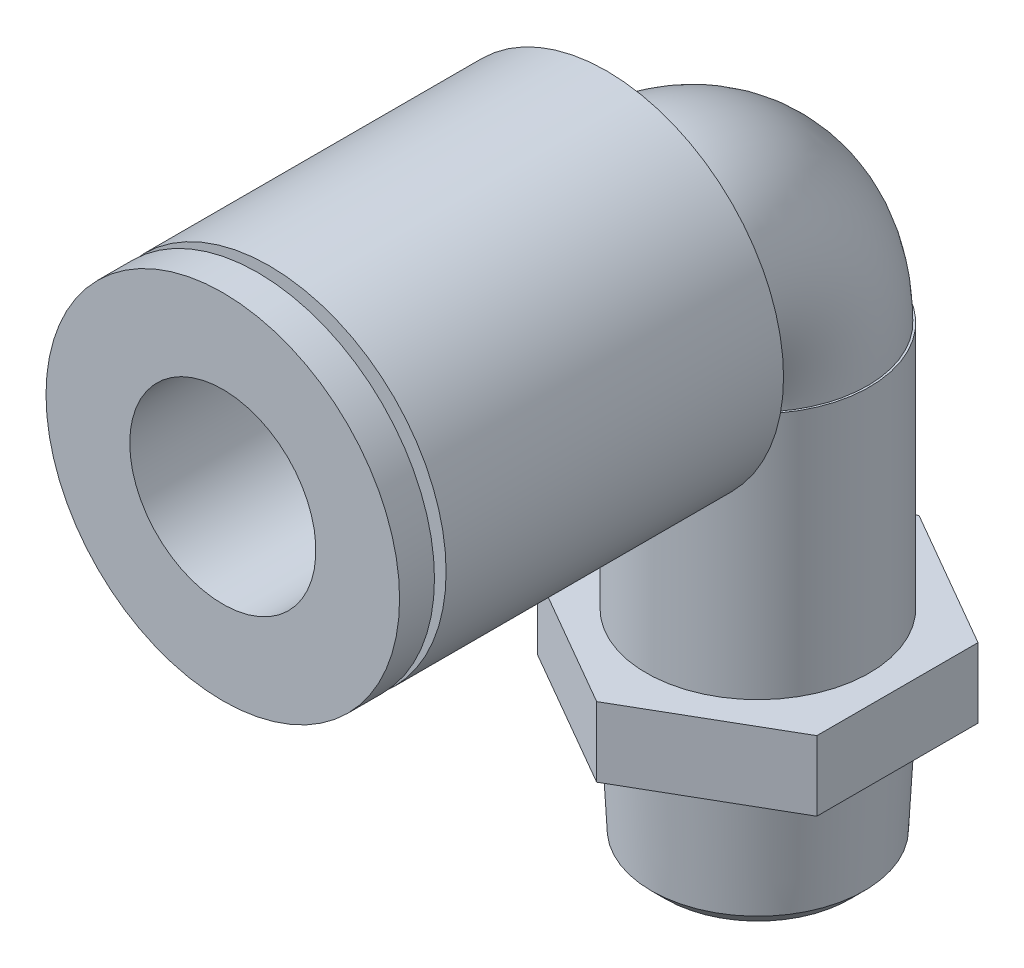
ISO-10303-21;
HEADER;
FILE_DESCRIPTION(('STEP AP214'),'2;1');
FILE_NAME('part.step','',(''),(''),'','','');
FILE_SCHEMA(('AUTOMOTIVE_DESIGN { 1 0 10303 214 1 1 1 1 }'));
ENDSEC;
DATA;
#1=APPLICATION_CONTEXT('core data for automotive mechanical design processes');
#2=APPLICATION_PROTOCOL_DEFINITION('international standard','automotive_design',2000,#1);
#3=PRODUCT_CONTEXT('',#1,'mechanical');
#4=PRODUCT('Part','Part','',(#3));
#5=PRODUCT_RELATED_PRODUCT_CATEGORY('part','',(#4));
#6=PRODUCT_DEFINITION_FORMATION('','',#4);
#7=PRODUCT_DEFINITION_CONTEXT('part definition',#1,'design');
#8=PRODUCT_DEFINITION('design','',#6,#7);
#9=PRODUCT_DEFINITION_SHAPE('','',#8);
#10=(LENGTH_UNIT() NAMED_UNIT(*) SI_UNIT(.MILLI.,.METRE.));
#11=(NAMED_UNIT(*) PLANE_ANGLE_UNIT() SI_UNIT($,.RADIAN.));
#12=(NAMED_UNIT(*) SI_UNIT($,.STERADIAN.) SOLID_ANGLE_UNIT());
#13=UNCERTAINTY_MEASURE_WITH_UNIT(LENGTH_MEASURE(1.E-05),#10,'distance_accuracy_value','');
#14=(GEOMETRIC_REPRESENTATION_CONTEXT(3) GLOBAL_UNCERTAINTY_ASSIGNED_CONTEXT((#13)) GLOBAL_UNIT_ASSIGNED_CONTEXT((#10,
#11,#12)) REPRESENTATION_CONTEXT('',''));
#15=CARTESIAN_POINT('',(0.,0.,0.));
#16=DIRECTION('',(0.,0.,1.));
#17=DIRECTION('',(1.,0.,0.));
#18=AXIS2_PLACEMENT_3D('',#15,#16,#17);
#19=CARTESIAN_POINT('',(-4.,20.451997891806,4.5));
#20=DIRECTION('',(0.,0.,1.));
#21=DIRECTION('',(1.,0.,0.));
#22=AXIS2_PLACEMENT_3D('',#19,#20,#21);
#23=PLANE('',#22);
#24=CARTESIAN_POINT('',(0.,24.5,4.5));
#25=DIRECTION('',(0.,0.,-1.));
#26=DIRECTION('',(-1.,0.,0.));
#27=AXIS2_PLACEMENT_3D('',#24,#25,#26);
#28=CIRCLE('',#27,4.);
#29=CARTESIAN_POINT('',(-4.,24.5,4.5));
#30=VERTEX_POINT('',#29);
#31=EDGE_CURVE('E19',#30,#30,#28,.T.);
#32=ORIENTED_EDGE('',*,*,#31,.F.);
#33=EDGE_LOOP('',(#32));
#34=FACE_BOUND('',#33,.T.);
#35=ADVANCED_FACE('F16',(#34),#23,.T.);
#36=CARTESIAN_POINT('',(0.,24.5,23.));
#37=DIRECTION('',(0.,0.,-1.));
#38=DIRECTION('',(-1.,0.,0.));
#39=AXIS2_PLACEMENT_3D('',#36,#37,#38);
#40=CYLINDRICAL_SURFACE('',#39,4.);
#41=ORIENTED_EDGE('',*,*,#31,.T.);
#42=EDGE_LOOP('',(#41));
#43=FACE_BOUND('',#42,.T.);
#44=CARTESIAN_POINT('',(0.,24.5,23.));
#45=DIRECTION('',(0.,0.,-1.));
#46=DIRECTION('',(-1.,0.,0.));
#47=AXIS2_PLACEMENT_3D('',#44,#45,#46);
#48=CIRCLE('',#47,4.);
#49=CARTESIAN_POINT('',(-4.,24.5,23.));
#50=VERTEX_POINT('',#49);
#51=EDGE_CURVE('E270',#50,#50,#48,.T.);
#52=ORIENTED_EDGE('',*,*,#51,.F.);
#53=EDGE_LOOP('',(#52));
#54=FACE_BOUND('',#53,.T.);
#55=ADVANCED_FACE('F257',(#43,#54),#40,.F.);
#56=CARTESIAN_POINT('',(7.6,32.1912021082628,23.));
#57=DIRECTION('',(0.,0.,1.));
#58=DIRECTION('',(-1.,0.,0.));
#59=AXIS2_PLACEMENT_3D('',#56,#57,#58);
#60=PLANE('',#59);
#61=ORIENTED_EDGE('',*,*,#51,.T.);
#62=EDGE_LOOP('',(#61));
#63=FACE_BOUND('',#62,.T.);
#64=CARTESIAN_POINT('',(0.,24.5,23.));
#65=DIRECTION('',(0.,0.,1.));
#66=DIRECTION('',(1.,0.,0.));
#67=AXIS2_PLACEMENT_3D('',#64,#65,#66);
#68=CIRCLE('',#67,7.60000000000001);
#69=CARTESIAN_POINT('',(7.60000000000001,24.5,23.));
#70=VERTEX_POINT('',#69);
#71=EDGE_CURVE('E271',#70,#70,#68,.F.);
#72=ORIENTED_EDGE('',*,*,#71,.F.);
#73=EDGE_LOOP('',(#72));
#74=FACE_BOUND('',#73,.T.);
#75=ADVANCED_FACE('F254',(#63,#74),#60,.T.);
#76=CARTESIAN_POINT('',(0.,24.5,23.));
#77=DIRECTION('',(0.,0.,1.));
#78=DIRECTION('',(1.,0.,0.));
#79=AXIS2_PLACEMENT_3D('',#76,#77,#78);
#80=CYLINDRICAL_SURFACE('',#79,7.60000000000001);
#81=ORIENTED_EDGE('',*,*,#71,.T.);
#82=EDGE_LOOP('',(#81));
#83=FACE_BOUND('',#82,.T.);
#84=CARTESIAN_POINT('',(0.,24.5,21.5));
#85=DIRECTION('',(0.,0.,1.));
#86=DIRECTION('',(1.,0.,0.));
#87=AXIS2_PLACEMENT_3D('',#84,#85,#86);
#88=CIRCLE('',#87,7.60000000000001);
#89=CARTESIAN_POINT('',(7.60000000000001,24.5,21.5));
#90=VERTEX_POINT('',#89);
#91=EDGE_CURVE('E273',#90,#90,#88,.F.);
#92=ORIENTED_EDGE('',*,*,#91,.F.);
#93=EDGE_LOOP('',(#92));
#94=FACE_BOUND('',#93,.T.);
#95=ADVANCED_FACE('F250',(#83,#94),#80,.T.);
#96=CARTESIAN_POINT('',(3.96101064172926,0.,4.00854487762027));
#97=DIRECTION('',(0.,-1.,0.));
#98=DIRECTION('',(-1.,0.,0.));
#99=AXIS2_PLACEMENT_3D('',#96,#97,#98);
#100=PLANE('',#99);
#101=CARTESIAN_POINT('',(0.,0.,0.));
#102=DIRECTION('',(0.,1.,0.));
#103=DIRECTION('',(0.,0.,1.));
#104=AXIS2_PLACEMENT_3D('',#101,#102,#103);
#105=CIRCLE('',#104,3.96101064172926);
#106=CARTESIAN_POINT('',(0.,0.,3.96101064172926));
#107=VERTEX_POINT('',#106);
#108=EDGE_CURVE('E278',#107,#107,#105,.T.);
#109=ORIENTED_EDGE('',*,*,#108,.F.);
#110=EDGE_LOOP('',(#109));
#111=FACE_BOUND('',#110,.T.);
#112=ADVANCED_FACE('F246',(#111),#100,.T.);
#113=CARTESIAN_POINT('',(-7.60000000000001,32.1912021082628,21.5));
#114=DIRECTION('',(0.,0.,-1.));
#115=DIRECTION('',(1.,0.,0.));
#116=AXIS2_PLACEMENT_3D('',#113,#114,#115);
#117=PLANE('',#116);
#118=CARTESIAN_POINT('',(0.,24.5,21.5));
#119=DIRECTION('',(0.,0.,1.));
#120=DIRECTION('',(0.,-1.,0.));
#121=AXIS2_PLACEMENT_3D('',#118,#119,#120);
#122=CIRCLE('',#121,6.);
#123=CARTESIAN_POINT('',(0.,18.5,21.5));
#124=VERTEX_POINT('',#123);
#125=EDGE_CURVE('E102',#124,#124,#122,.F.);
#126=ORIENTED_EDGE('',*,*,#125,.F.);
#127=EDGE_LOOP('',(#126));
#128=FACE_BOUND('',#127,.T.);
#129=ORIENTED_EDGE('',*,*,#91,.T.);
#130=EDGE_LOOP('',(#129));
#131=FACE_BOUND('',#130,.T.);
#132=ADVANCED_FACE('F242',(#128,#131),#117,.T.);
#133=CARTESIAN_POINT('',(0.,0.,0.));
#134=DIRECTION('',(0.,1.,0.));
#135=DIRECTION('',(0.,0.,1.));
#136=AXIS2_PLACEMENT_3D('',#133,#134,#135);
#137=CONICAL_SURFACE('',#136,3.96101064172926,0.785398163397448);
#138=CARTESIAN_POINT('',(0.,0.62034509794002,0.));
#139=DIRECTION('',(0.,-1.,0.));
#140=DIRECTION('',(-1.,0.,0.));
#141=AXIS2_PLACEMENT_3D('',#138,#139,#140);
#142=CIRCLE('',#141,4.58135573966928);
#143=CARTESIAN_POINT('',(-4.58135573966928,0.62034509794002,0.));
#144=VERTEX_POINT('',#143);
#145=EDGE_CURVE('E99',#144,#144,#142,.F.);
#146=ORIENTED_EDGE('',*,*,#145,.F.);
#147=EDGE_LOOP('',(#146));
#148=FACE_BOUND('',#147,.T.);
#149=ORIENTED_EDGE('',*,*,#108,.T.);
#150=EDGE_LOOP('',(#149));
#151=FACE_BOUND('',#150,.T.);
#152=ADVANCED_FACE('F238',(#148,#151),#137,.T.);
#153=CARTESIAN_POINT('',(0.,24.5,21.5));
#154=DIRECTION('',(0.,0.,1.));
#155=DIRECTION('',(0.,-1.,0.));
#156=AXIS2_PLACEMENT_3D('',#153,#154,#155);
#157=CYLINDRICAL_SURFACE('',#156,6.);
#158=ORIENTED_EDGE('',*,*,#125,.T.);
#159=EDGE_LOOP('',(#158));
#160=FACE_BOUND('',#159,.T.);
#161=CARTESIAN_POINT('',(0.,24.5,21.));
#162=DIRECTION('',(0.,0.,1.));
#163=DIRECTION('',(0.,-1.,0.));
#164=AXIS2_PLACEMENT_3D('',#161,#162,#163);
#165=CIRCLE('',#164,6.);
#166=CARTESIAN_POINT('',(0.,18.5,21.));
#167=VERTEX_POINT('',#166);
#168=EDGE_CURVE('E101',#167,#167,#165,.F.);
#169=ORIENTED_EDGE('',*,*,#168,.F.);
#170=EDGE_LOOP('',(#169));
#171=FACE_BOUND('',#170,.T.);
#172=ADVANCED_FACE('F234',(#160,#171),#157,.T.);
#173=CARTESIAN_POINT('',(0.,0.62034509794002,0.));
#174=DIRECTION('',(0.,1.,0.));
#175=DIRECTION('',(0.,0.,1.));
#176=AXIS2_PLACEMENT_3D('',#173,#174,#175);
#177=CONICAL_SURFACE('',#176,4.58135573966928,0.0523598775598302);
#178=CARTESIAN_POINT('',(0.,5.838,0.));
#179=DIRECTION('',(0.,1.,0.));
#180=DIRECTION('',(0.,0.,1.));
#181=AXIS2_PLACEMENT_3D('',#178,#179,#180);
#182=CIRCLE('',#181,4.85480144615152);
#183=CARTESIAN_POINT('',(0.,5.838,4.85480144615152));
#184=VERTEX_POINT('',#183);
#185=EDGE_CURVE('E285',#184,#184,#182,.T.);
#186=ORIENTED_EDGE('',*,*,#185,.F.);
#187=EDGE_LOOP('',(#186));
#188=FACE_BOUND('',#187,.T.);
#189=ORIENTED_EDGE('',*,*,#145,.T.);
#190=EDGE_LOOP('',(#189));
#191=FACE_BOUND('',#190,.T.);
#192=ADVANCED_FACE('F230',(#188,#191),#177,.T.);
#193=CARTESIAN_POINT('',(7.6,32.1912021082628,21.));
#194=DIRECTION('',(0.,0.,1.));
#195=DIRECTION('',(-1.,0.,0.));
#196=AXIS2_PLACEMENT_3D('',#193,#194,#195);
#197=PLANE('',#196);
#198=ORIENTED_EDGE('',*,*,#168,.T.);
#199=EDGE_LOOP('',(#198));
#200=FACE_BOUND('',#199,.T.);
#201=CARTESIAN_POINT('',(0.,24.5,21.));
#202=DIRECTION('',(0.,0.,1.));
#203=DIRECTION('',(1.,0.,0.));
#204=AXIS2_PLACEMENT_3D('',#201,#202,#203);
#205=CIRCLE('',#204,7.6);
#206=CARTESIAN_POINT('',(7.6,24.5,21.));
#207=VERTEX_POINT('',#206);
#208=EDGE_CURVE('E80',#207,#207,#205,.F.);
#209=ORIENTED_EDGE('',*,*,#208,.F.);
#210=EDGE_LOOP('',(#209));
#211=FACE_BOUND('',#210,.T.);
#212=ADVANCED_FACE('F226',(#200,#211),#197,.T.);
#213=CARTESIAN_POINT('',(-6.,5.838,6.92820323027551));
#214=DIRECTION('',(0.,-1.,0.));
#215=DIRECTION('',(0.,0.,-1.));
#216=AXIS2_PLACEMENT_3D('',#213,#214,#215);
#217=PLANE('',#216);
#218=ORIENTED_EDGE('',*,*,#185,.T.);
#219=EDGE_LOOP('',(#218));
#220=FACE_BOUND('',#219,.T.);
#221=DIRECTION('',(0.866025403784438,0.,-0.5));
#222=VECTOR('',#221,1.);
#223=CARTESIAN_POINT('',(3.,5.838,5.19615242270663));
#224=LINE('',#223,#222);
#225=CARTESIAN_POINT('',(6.25179972894851E-08,5.838,6.92820319418073));
#226=VERTEX_POINT('',#225);
#227=CARTESIAN_POINT('',(6.,5.838,3.46410161513775));
#228=VERTEX_POINT('',#227);
#229=EDGE_CURVE('E185',#226,#228,#224,.T.);
#230=ORIENTED_EDGE('',*,*,#229,.F.);
#231=DIRECTION('',(0.866025403784438,0.,0.5));
#232=VECTOR('',#231,1.);
#233=CARTESIAN_POINT('',(-3.,5.838,5.19615242270663));
#234=LINE('',#233,#232);
#235=CARTESIAN_POINT('',(-6.,5.838,3.46410161513775));
#236=VERTEX_POINT('',#235);
#237=EDGE_CURVE('E84',#236,#226,#234,.T.);
#238=ORIENTED_EDGE('',*,*,#237,.F.);
#239=DIRECTION('',(0.,0.,1.));
#240=VECTOR('',#239,1.);
#241=CARTESIAN_POINT('',(-6.,5.838,0.));
#242=LINE('',#241,#240);
#243=CARTESIAN_POINT('',(-6.,5.838,-3.46410161513775));
#244=VERTEX_POINT('',#243);
#245=EDGE_CURVE('E66',#244,#236,#242,.T.);
#246=ORIENTED_EDGE('',*,*,#245,.F.);
#247=DIRECTION('',(-0.866025403784438,0.,0.5));
#248=VECTOR('',#247,1.);
#249=CARTESIAN_POINT('',(-3.,5.838,-5.19615242270663));
#250=LINE('',#249,#248);
#251=CARTESIAN_POINT('',(-1.25035995012651E-07,5.838,-6.92820315808594));
#252=VERTEX_POINT('',#251);
#253=EDGE_CURVE('E71',#252,#244,#250,.T.);
#254=ORIENTED_EDGE('',*,*,#253,.F.);
#255=DIRECTION('',(-0.866025403784438,0.,-0.5));
#256=VECTOR('',#255,1.);
#257=CARTESIAN_POINT('',(3.,5.838,-5.19615242270663));
#258=LINE('',#257,#256);
#259=CARTESIAN_POINT('',(6.,5.838,-3.46410161513775));
#260=VERTEX_POINT('',#259);
#261=EDGE_CURVE('E177',#260,#252,#258,.T.);
#262=ORIENTED_EDGE('',*,*,#261,.F.);
#263=DIRECTION('',(0.,0.,-1.));
#264=VECTOR('',#263,1.);
#265=CARTESIAN_POINT('',(6.,5.838,0.));
#266=LINE('',#265,#264);
#267=EDGE_CURVE('E180',#228,#260,#266,.T.);
#268=ORIENTED_EDGE('',*,*,#267,.F.);
#269=EDGE_LOOP('',(#230,#238,#246,#254,#262,#268));
#270=FACE_BOUND('',#269,.T.);
#271=ADVANCED_FACE('F83',(#220,#270),#217,.T.);
#272=CARTESIAN_POINT('',(0.,24.5,21.));
#273=DIRECTION('',(0.,0.,1.));
#274=DIRECTION('',(1.,0.,0.));
#275=AXIS2_PLACEMENT_3D('',#272,#273,#274);
#276=CYLINDRICAL_SURFACE('',#275,7.6);
#277=ORIENTED_EDGE('',*,*,#208,.T.);
#278=EDGE_LOOP('',(#277));
#279=FACE_BOUND('',#278,.T.);
#280=CARTESIAN_POINT('',(0.,24.5,6.49532747366641));
#281=DIRECTION('',(0.,0.,-1.));
#282=DIRECTION('',(-1.,0.,0.));
#283=AXIS2_PLACEMENT_3D('',#280,#281,#282);
#284=CIRCLE('',#283,7.6);
#285=CARTESIAN_POINT('',(-7.6,24.5,6.49532747366641));
#286=VERTEX_POINT('',#285);
#287=EDGE_CURVE('E95',#286,#286,#284,.T.);
#288=ORIENTED_EDGE('',*,*,#287,.F.);
#289=EDGE_LOOP('',(#288));
#290=FACE_BOUND('',#289,.T.);
#291=ADVANCED_FACE('F220',(#279,#290),#276,.T.);
#292=CARTESIAN_POINT('',(0.,5.838,-6.92820323027551));
#293=DIRECTION('',(-0.5,0.,-0.866025403784438));
#294=DIRECTION('',(-0.866025403784438,0.,0.5));
#295=AXIS2_PLACEMENT_3D('',#292,#293,#294);
#296=PLANE('',#295);
#297=ORIENTED_EDGE('',*,*,#253,.T.);
#298=DIRECTION('',(0.,1.,0.));
#299=VECTOR('',#298,1.);
#300=CARTESIAN_POINT('',(-6.,5.838,-3.46410161513775));
#301=LINE('',#300,#299);
#302=CARTESIAN_POINT('',(-6.,8.838,-3.46410161513775));
#303=VERTEX_POINT('',#302);
#304=EDGE_CURVE('E73',#303,#244,#301,.F.);
#305=ORIENTED_EDGE('',*,*,#304,.F.);
#306=CARTESIAN_POINT('',(0.,8.838,-6.92820323027551));
#307=CARTESIAN_POINT('',(-0.25,8.838,-6.7838656629781));
#308=CARTESIAN_POINT('',(-0.5,8.838,-6.6395280956807));
#309=CARTESIAN_POINT('',(-1.,8.838,-6.35085296108588));
#310=CARTESIAN_POINT('',(-1.25,8.838,-6.20651539378848));
#311=CARTESIAN_POINT('',(-1.75,8.838,-5.91784025919366));
#312=CARTESIAN_POINT('',(-2.,8.838,-5.77350269189626));
#313=CARTESIAN_POINT('',(-2.5,8.838,-5.48482755730144));
#314=CARTESIAN_POINT('',(-2.75,8.838,-5.34048999000404));
#315=CARTESIAN_POINT('',(-3.25,8.838,-5.05181485540922));
#316=CARTESIAN_POINT('',(-3.5,8.838,-4.90747728811182));
#317=CARTESIAN_POINT('',(-4.,8.838,-4.618802153517));
#318=CARTESIAN_POINT('',(-4.25,8.838,-4.4744645862196));
#319=CARTESIAN_POINT('',(-4.75,8.838,-4.18578945162478));
#320=CARTESIAN_POINT('',(-5.,8.838,-4.04145188432738));
#321=CARTESIAN_POINT('',(-5.5,8.838,-3.75277674973256));
#322=CARTESIAN_POINT('',(-5.75,8.838,-3.60843918243516));
#323=CARTESIAN_POINT('',(-6.,8.838,-3.46410161513775));
#324=B_SPLINE_CURVE_WITH_KNOTS('',3,(#306,#307,#308,#309,#310,#311,#312,#313,#314,#315,#316,
#317,#318,#319,#320,#321,#322,#323),.UNSPECIFIED.,.F.,.F.,(4,2,2,2,2,2,2,2,4),(0.,
0.866025403784439,1.73205080756888,2.59807621135332,3.46410161513776,4.3301270189222,
5.19615242270663,6.06217782649107,6.92820323027551),.UNSPECIFIED.);
#325=CARTESIAN_POINT('',(-6.25179975063256E-08,8.838,-6.92820319418073));
#326=VERTEX_POINT('',#325);
#327=EDGE_CURVE('E98',#326,#303,#324,.T.);
#328=ORIENTED_EDGE('',*,*,#327,.F.);
#329=DIRECTION('',(0.,1.,0.));
#330=VECTOR('',#329,1.);
#331=CARTESIAN_POINT('',(0.,5.838,-6.92820323027551));
#332=LINE('',#331,#330);
#333=EDGE_CURVE('E76',#252,#326,#332,.T.);
#334=ORIENTED_EDGE('',*,*,#333,.F.);
#335=EDGE_LOOP('',(#297,#305,#328,#334));
#336=FACE_BOUND('',#335,.T.);
#337=ADVANCED_FACE('F72',(#336),#296,.T.);
#338=CARTESIAN_POINT('',(-6.,5.838,-3.46410161513775));
#339=DIRECTION('',(-1.,0.,0.));
#340=DIRECTION('',(0.,0.,1.));
#341=AXIS2_PLACEMENT_3D('',#338,#339,#340);
#342=PLANE('',#341);
#343=ORIENTED_EDGE('',*,*,#245,.T.);
#344=DIRECTION('',(0.,1.,0.));
#345=VECTOR('',#344,1.);
#346=CARTESIAN_POINT('',(-6.,5.838,3.46410161513775));
#347=LINE('',#346,#345);
#348=CARTESIAN_POINT('',(-6.,8.838,3.46410161513775));
#349=VERTEX_POINT('',#348);
#350=EDGE_CURVE('E86',#349,#236,#347,.F.);
#351=ORIENTED_EDGE('',*,*,#350,.F.);
#352=DIRECTION('',(0.,0.,1.));
#353=VECTOR('',#352,1.);
#354=CARTESIAN_POINT('',(-6.,8.838,0.));
#355=LINE('',#354,#353);
#356=EDGE_CURVE('E90',#303,#349,#355,.T.);
#357=ORIENTED_EDGE('',*,*,#356,.F.);
#358=ORIENTED_EDGE('',*,*,#304,.T.);
#359=EDGE_LOOP('',(#343,#351,#357,#358));
#360=FACE_BOUND('',#359,.T.);
#361=ADVANCED_FACE('F88',(#360),#342,.T.);
#362=CARTESIAN_POINT('',(-6.,5.838,3.46410161513775));
#363=DIRECTION('',(-0.5,0.,0.866025403784438));
#364=DIRECTION('',(0.866025403784438,0.,0.5));
#365=AXIS2_PLACEMENT_3D('',#362,#363,#364);
#366=PLANE('',#365);
#367=ORIENTED_EDGE('',*,*,#237,.T.);
#368=DIRECTION('',(0.,1.,0.));
#369=VECTOR('',#368,1.);
#370=CARTESIAN_POINT('',(0.,5.838,6.92820323027551));
#371=LINE('',#370,#369);
#372=CARTESIAN_POINT('',(-6.25179975063256E-08,8.838,6.92820319418073));
#373=VERTEX_POINT('',#372);
#374=EDGE_CURVE('E187',#373,#226,#371,.F.);
#375=ORIENTED_EDGE('',*,*,#374,.F.);
#376=CARTESIAN_POINT('',(-6.,8.838,3.46410161513775));
#377=CARTESIAN_POINT('',(-5.75,8.838,3.60843918243516));
#378=CARTESIAN_POINT('',(-5.5,8.838,3.75277674973256));
#379=CARTESIAN_POINT('',(-5.,8.838,4.04145188432738));
#380=CARTESIAN_POINT('',(-4.75,8.838,4.18578945162478));
#381=CARTESIAN_POINT('',(-4.25,8.838,4.4744645862196));
#382=CARTESIAN_POINT('',(-4.,8.838,4.618802153517));
#383=CARTESIAN_POINT('',(-3.5,8.838,4.90747728811182));
#384=CARTESIAN_POINT('',(-3.25,8.838,5.05181485540922));
#385=CARTESIAN_POINT('',(-2.75,8.838,5.34048999000404));
#386=CARTESIAN_POINT('',(-2.5,8.838,5.48482755730144));
#387=CARTESIAN_POINT('',(-2.,8.838,5.77350269189626));
#388=CARTESIAN_POINT('',(-1.75,8.838,5.91784025919366));
#389=CARTESIAN_POINT('',(-1.25,8.838,6.20651539378848));
#390=CARTESIAN_POINT('',(-1.,8.838,6.35085296108588));
#391=CARTESIAN_POINT('',(-0.5,8.838,6.6395280956807));
#392=CARTESIAN_POINT('',(-0.25,8.838,6.7838656629781));
#393=CARTESIAN_POINT('',(0.,8.838,6.92820323027551));
#394=B_SPLINE_CURVE_WITH_KNOTS('',3,(#376,#377,#378,#379,#380,#381,#382,#383,#384,#385,#386,
#387,#388,#389,#390,#391,#392,#393),.UNSPECIFIED.,.F.,.F.,(4,2,2,2,2,2,2,2,4),(0.,
0.866025403784439,1.73205080756888,2.59807621135332,3.46410161513776,4.3301270189222,
5.19615242270663,6.06217782649107,6.92820323027551),.UNSPECIFIED.);
#395=EDGE_CURVE('E155',#349,#373,#394,.T.);
#396=ORIENTED_EDGE('',*,*,#395,.F.);
#397=ORIENTED_EDGE('',*,*,#350,.T.);
#398=EDGE_LOOP('',(#367,#375,#396,#397));
#399=FACE_BOUND('',#398,.T.);
#400=ADVANCED_FACE('F191',(#399),#366,.T.);
#401=CARTESIAN_POINT('',(0.,5.838,6.92820323027551));
#402=DIRECTION('',(0.5,0.,0.866025403784438));
#403=DIRECTION('',(0.866025403784438,0.,-0.5));
#404=AXIS2_PLACEMENT_3D('',#401,#402,#403);
#405=PLANE('',#404);
#406=ORIENTED_EDGE('',*,*,#229,.T.);
#407=DIRECTION('',(0.,1.,0.));
#408=VECTOR('',#407,1.);
#409=CARTESIAN_POINT('',(6.,5.838,3.46410161513775));
#410=LINE('',#409,#408);
#411=CARTESIAN_POINT('',(6.,8.838,3.46410161513775));
#412=VERTEX_POINT('',#411);
#413=EDGE_CURVE('E182',#412,#228,#410,.F.);
#414=ORIENTED_EDGE('',*,*,#413,.F.);
#415=CARTESIAN_POINT('',(0.,8.838,6.92820323027551));
#416=CARTESIAN_POINT('',(0.25,8.838,6.7838656629781));
#417=CARTESIAN_POINT('',(0.500000000000001,8.838,6.6395280956807));
#418=CARTESIAN_POINT('',(1.,8.838,6.35085296108588));
#419=CARTESIAN_POINT('',(1.25,8.838,6.20651539378848));
#420=CARTESIAN_POINT('',(1.75,8.838,5.91784025919366));
#421=CARTESIAN_POINT('',(2.,8.838,5.77350269189626));
#422=CARTESIAN_POINT('',(2.5,8.838,5.48482755730144));
#423=CARTESIAN_POINT('',(2.75,8.838,5.34048999000404));
#424=CARTESIAN_POINT('',(3.25,8.838,5.05181485540922));
#425=CARTESIAN_POINT('',(3.5,8.838,4.90747728811182));
#426=CARTESIAN_POINT('',(4.,8.838,4.618802153517));
#427=CARTESIAN_POINT('',(4.25,8.838,4.4744645862196));
#428=CARTESIAN_POINT('',(4.75,8.838,4.18578945162478));
#429=CARTESIAN_POINT('',(5.,8.838,4.04145188432738));
#430=CARTESIAN_POINT('',(5.5,8.838,3.75277674973256));
#431=CARTESIAN_POINT('',(5.75,8.838,3.60843918243516));
#432=CARTESIAN_POINT('',(6.,8.838,3.46410161513775));
#433=B_SPLINE_CURVE_WITH_KNOTS('',3,(#415,#416,#417,#418,#419,#420,#421,#422,#423,#424,#425,
#426,#427,#428,#429,#430,#431,#432),.UNSPECIFIED.,.F.,.F.,(4,2,2,2,2,2,2,2,4),(0.,
0.866025403784439,1.73205080756888,2.59807621135332,3.46410161513776,4.3301270189222,
5.19615242270663,6.06217782649107,6.92820323027551),.UNSPECIFIED.);
#434=EDGE_CURVE('E151',#373,#412,#433,.T.);
#435=ORIENTED_EDGE('',*,*,#434,.F.);
#436=ORIENTED_EDGE('',*,*,#374,.T.);
#437=EDGE_LOOP('',(#406,#414,#435,#436));
#438=FACE_BOUND('',#437,.T.);
#439=ADVANCED_FACE('F194',(#438),#405,.T.);
#440=CARTESIAN_POINT('',(6.,5.838,3.46410161513775));
#441=DIRECTION('',(1.,0.,0.));
#442=DIRECTION('',(0.,0.,-1.));
#443=AXIS2_PLACEMENT_3D('',#440,#441,#442);
#444=PLANE('',#443);
#445=ORIENTED_EDGE('',*,*,#267,.T.);
#446=DIRECTION('',(0.,1.,0.));
#447=VECTOR('',#446,1.);
#448=CARTESIAN_POINT('',(6.,5.838,-3.46410161513775));
#449=LINE('',#448,#447);
#450=CARTESIAN_POINT('',(6.,8.838,-3.46410161513775));
#451=VERTEX_POINT('',#450);
#452=EDGE_CURVE('E34',#451,#260,#449,.F.);
#453=ORIENTED_EDGE('',*,*,#452,.F.);
#454=DIRECTION('',(0.,0.,-1.));
#455=VECTOR('',#454,1.);
#456=CARTESIAN_POINT('',(6.,8.838,0.));
#457=LINE('',#456,#455);
#458=EDGE_CURVE('E154',#412,#451,#457,.T.);
#459=ORIENTED_EDGE('',*,*,#458,.F.);
#460=ORIENTED_EDGE('',*,*,#413,.T.);
#461=EDGE_LOOP('',(#445,#453,#459,#460));
#462=FACE_BOUND('',#461,.T.);
#463=ADVANCED_FACE('F197',(#462),#444,.T.);
#464=CARTESIAN_POINT('',(6.,5.838,-3.46410161513775));
#465=DIRECTION('',(0.5,0.,-0.866025403784438));
#466=DIRECTION('',(-0.866025403784438,0.,-0.5));
#467=AXIS2_PLACEMENT_3D('',#464,#465,#466);
#468=PLANE('',#467);
#469=ORIENTED_EDGE('',*,*,#261,.T.);
#470=ORIENTED_EDGE('',*,*,#333,.T.);
#471=CARTESIAN_POINT('',(6.,8.838,-3.46410161513775));
#472=CARTESIAN_POINT('',(5.75,8.838,-3.60843918243516));
#473=CARTESIAN_POINT('',(5.5,8.838,-3.75277674973256));
#474=CARTESIAN_POINT('',(5.,8.838,-4.04145188432738));
#475=CARTESIAN_POINT('',(4.75,8.838,-4.18578945162478));
#476=CARTESIAN_POINT('',(4.25,8.838,-4.4744645862196));
#477=CARTESIAN_POINT('',(4.,8.838,-4.618802153517));
#478=CARTESIAN_POINT('',(3.5,8.838,-4.90747728811182));
#479=CARTESIAN_POINT('',(3.25,8.838,-5.05181485540922));
#480=CARTESIAN_POINT('',(2.75,8.838,-5.34048999000404));
#481=CARTESIAN_POINT('',(2.5,8.838,-5.48482755730144));
#482=CARTESIAN_POINT('',(2.,8.838,-5.77350269189626));
#483=CARTESIAN_POINT('',(1.75,8.838,-5.91784025919366));
#484=CARTESIAN_POINT('',(1.25,8.838,-6.20651539378848));
#485=CARTESIAN_POINT('',(1.,8.838,-6.35085296108588));
#486=CARTESIAN_POINT('',(0.500000000000001,8.838,-6.6395280956807));
#487=CARTESIAN_POINT('',(0.250000000000001,8.838,-6.7838656629781));
#488=CARTESIAN_POINT('',(0.,8.838,-6.92820323027551));
#489=B_SPLINE_CURVE_WITH_KNOTS('',3,(#471,#472,#473,#474,#475,#476,#477,#478,#479,#480,#481,
#482,#483,#484,#485,#486,#487,#488),.UNSPECIFIED.,.F.,.F.,(4,2,2,2,2,2,2,2,4),(0.,
0.866025403784438,1.73205080756888,2.59807621135332,3.46410161513775,4.3301270189222,
5.19615242270663,6.06217782649107,6.92820323027551),.UNSPECIFIED.);
#490=EDGE_CURVE('E147',#451,#326,#489,.T.);
#491=ORIENTED_EDGE('',*,*,#490,.F.);
#492=ORIENTED_EDGE('',*,*,#452,.T.);
#493=EDGE_LOOP('',(#469,#470,#491,#492));
#494=FACE_BOUND('',#493,.T.);
#495=ADVANCED_FACE('F200',(#494),#468,.T.);
#496=CARTESIAN_POINT('',(0.,24.5,5.75));
#497=DIRECTION('',(0.,0.,1.));
#498=DIRECTION('',(1.,0.,0.));
#499=AXIS2_PLACEMENT_3D('',#496,#497,#498);
#500=CONICAL_SURFACE('',#499,4.8184,1.30899693899575);
#501=ORIENTED_EDGE('',*,*,#287,.T.);
#502=EDGE_LOOP('',(#501));
#503=FACE_BOUND('',#502,.T.);
#504=CARTESIAN_POINT('',(0.,24.5,5.75));
#505=DIRECTION('',(0.,0.,1.));
#506=DIRECTION('',(-1.,0.,0.));
#507=AXIS2_PLACEMENT_3D('',#504,#505,#506);
#508=CIRCLE('',#507,4.8184);
#509=CARTESIAN_POINT('',(-4.8184,24.5,5.75));
#510=VERTEX_POINT('',#509);
#511=EDGE_CURVE('E172',#510,#510,#508,.F.);
#512=ORIENTED_EDGE('',*,*,#511,.F.);
#513=EDGE_LOOP('',(#512));
#514=FACE_BOUND('',#513,.T.);
#515=ADVANCED_FACE('F202',(#503,#514),#500,.T.);
#516=CARTESIAN_POINT('',(-6.,8.838,-6.92820323027551));
#517=DIRECTION('',(0.,1.,0.));
#518=DIRECTION('',(0.,0.,1.));
#519=AXIS2_PLACEMENT_3D('',#516,#517,#518);
#520=PLANE('',#519);
#521=CARTESIAN_POINT('',(0.,8.838,0.));
#522=DIRECTION('',(0.,-1.,0.));
#523=DIRECTION('',(0.,0.,-1.));
#524=AXIS2_PLACEMENT_3D('',#521,#522,#523);
#525=CIRCLE('',#524,4.8);
#526=CARTESIAN_POINT('',(0.,8.838,-4.8));
#527=VERTEX_POINT('',#526);
#528=EDGE_CURVE('E175',#527,#527,#525,.F.);
#529=ORIENTED_EDGE('',*,*,#528,.F.);
#530=EDGE_LOOP('',(#529));
#531=FACE_BOUND('',#530,.T.);
#532=ORIENTED_EDGE('',*,*,#458,.T.);
#533=ORIENTED_EDGE('',*,*,#490,.T.);
#534=ORIENTED_EDGE('',*,*,#327,.T.);
#535=ORIENTED_EDGE('',*,*,#356,.T.);
#536=ORIENTED_EDGE('',*,*,#395,.T.);
#537=ORIENTED_EDGE('',*,*,#434,.T.);
#538=EDGE_LOOP('',(#532,#533,#534,#535,#536,#537));
#539=FACE_BOUND('',#538,.T.);
#540=ADVANCED_FACE('F141',(#531,#539),#520,.T.);
#541=CARTESIAN_POINT('',(0.,24.5,5.75));
#542=DIRECTION('',(0.,0.,1.));
#543=DIRECTION('',(1.,0.,0.));
#544=AXIS2_PLACEMENT_3D('',#541,#542,#543);
#545=CYLINDRICAL_SURFACE('',#544,4.8184);
#546=ORIENTED_EDGE('',*,*,#511,.T.);
#547=EDGE_LOOP('',(#546));
#548=FACE_BOUND('',#547,.T.);
#549=CARTESIAN_POINT('',(0.,24.5,4.864));
#550=DIRECTION('',(0.,0.,1.));
#551=DIRECTION('',(1.,0.,0.));
#552=AXIS2_PLACEMENT_3D('',#549,#550,#551);
#553=CIRCLE('',#552,4.8184);
#554=CARTESIAN_POINT('',(4.8184,24.5,4.864));
#555=VERTEX_POINT('',#554);
#556=EDGE_CURVE('E292',#555,#555,#553,.F.);
#557=ORIENTED_EDGE('',*,*,#556,.F.);
#558=EDGE_LOOP('',(#557));
#559=FACE_BOUND('',#558,.T.);
#560=ADVANCED_FACE('F139',(#548,#559),#545,.T.);
#561=CARTESIAN_POINT('',(0.,8.838,0.));
#562=DIRECTION('',(0.,-1.,0.));
#563=DIRECTION('',(0.,0.,-1.));
#564=AXIS2_PLACEMENT_3D('',#561,#562,#563);
#565=CYLINDRICAL_SURFACE('',#564,4.8);
#566=ORIENTED_EDGE('',*,*,#528,.T.);
#567=EDGE_LOOP('',(#566));
#568=FACE_BOUND('',#567,.T.);
#569=CARTESIAN_POINT('',(0.,19.484,0.));
#570=DIRECTION('',(0.,-1.,0.));
#571=DIRECTION('',(0.,0.,-1.));
#572=AXIS2_PLACEMENT_3D('',#569,#570,#571);
#573=CIRCLE('',#572,4.8);
#574=CARTESIAN_POINT('',(0.,19.484,-4.8));
#575=VERTEX_POINT('',#574);
#576=EDGE_CURVE('E294',#575,#575,#573,.F.);
#577=ORIENTED_EDGE('',*,*,#576,.F.);
#578=EDGE_LOOP('',(#577));
#579=FACE_BOUND('',#578,.T.);
#580=ADVANCED_FACE('F305',(#568,#579),#565,.T.);
#581=CARTESIAN_POINT('',(-4.8184,29.3762229082266,4.864));
#582=DIRECTION('',(0.,0.,-1.));
#583=DIRECTION('',(1.,0.,0.));
#584=AXIS2_PLACEMENT_3D('',#581,#582,#583);
#585=PLANE('',#584);
#586=CARTESIAN_POINT('',(0.,29.2108124275119,4.864));
#587=CARTESIAN_POINT('',(0.264818375260694,29.2108064791344,4.864));
#588=CARTESIAN_POINT('',(0.529707097156744,29.188423564197,4.864));
#589=CARTESIAN_POINT('',(1.05204847358365,29.0994929961843,4.864));
#590=CARTESIAN_POINT('',(1.309497754097,29.0329256222358,4.864));
#591=CARTESIAN_POINT('',(1.80952703209668,28.8575207594618,4.864));
#592=CARTESIAN_POINT('',(2.05210971403572,28.7486909281353,4.864));
#593=CARTESIAN_POINT('',(2.51553774573025,28.4918607174521,4.864));
#594=CARTESIAN_POINT('',(2.73638498977032,28.3438637557395,4.864));
#595=CARTESIAN_POINT('',(3.15011773889993,28.0128854333414,4.864));
#596=CARTESIAN_POINT('',(3.34300122305522,27.8299015463728,4.864));
#597=CARTESIAN_POINT('',(3.69531602204112,27.434149663015,4.864));
#598=CARTESIAN_POINT('',(3.85474695243157,27.2213813243866,4.864));
#599=CARTESIAN_POINT('',(4.13564748837991,26.7720797451952,4.864));
#600=CARTESIAN_POINT('',(4.25711321938636,26.535544082303,4.864));
#601=CARTESIAN_POINT('',(4.45862026985442,26.0454399480199,4.864));
#602=CARTESIAN_POINT('',(4.53866134847745,25.7918713776114,4.864));
#603=CARTESIAN_POINT('',(4.65507009571854,25.2748360270032,4.864));
#604=CARTESIAN_POINT('',(4.69142721058108,25.0113668707365,4.864));
#605=CARTESIAN_POINT('',(4.71941461638683,24.4820713059928,4.864));
#606=CARTESIAN_POINT('',(4.71104601185108,24.2162449558895,4.864));
#607=CARTESIAN_POINT('',(4.64982840869492,23.6896393922221,4.864));
#608=CARTESIAN_POINT('',(4.59695865175131,23.4288625921924,4.864));
#609=CARTESIAN_POINT('',(4.4482364996109,22.9198424230342,4.864));
#610=CARTESIAN_POINT('',(4.35237971402775,22.6716003369933,4.864));
#611=CARTESIAN_POINT('',(4.12028617233941,22.1943481609545,4.864));
#612=CARTESIAN_POINT('',(3.98399383666211,21.9653651026124,4.864));
#613=CARTESIAN_POINT('',(3.67508499143406,21.5335201547262,4.864));
#614=CARTESIAN_POINT('',(3.50248209434941,21.3306485220802,4.864));
#615=CARTESIAN_POINT('',(3.12527956925159,20.9558628325348,4.864));
#616=CARTESIAN_POINT('',(2.92057602545248,20.7840533607605,4.864));
#617=CARTESIAN_POINT('',(2.48534802384917,20.4765684402982,4.864));
#618=CARTESIAN_POINT('',(2.25479339778911,20.3409358467862,4.864));
#619=CARTESIAN_POINT('',(1.77090633333915,20.1072813010812,4.864));
#620=CARTESIAN_POINT('',(1.51728173126482,20.0098602737077,4.864));
#621=CARTESIAN_POINT('',(1.12801397610509,19.8960564200137,4.864));
#622=CARTESIAN_POINT('',(0.996878024210488,19.863520865008,4.864));
#623=CARTESIAN_POINT('',(0.73233355551775,19.8097561593334,4.864));
#624=CARTESIAN_POINT('',(0.598926853219052,19.7885183817503,4.864));
#625=CARTESIAN_POINT('',(0.387656476129457,19.7648673543262,4.864));
#626=CARTESIAN_POINT('',(0.310240542703642,19.758290341446,4.864));
#627=CARTESIAN_POINT('',(0.155217913939375,19.7494932673967,4.864));
#628=CARTESIAN_POINT('',(0.0776114227926693,19.7472696967939,4.864));
#629=CARTESIAN_POINT('',(-0.101630175639961,19.7472743756889,4.864));
#630=CARTESIAN_POINT('',(-0.203268807688415,19.7510933110176,4.864));
#631=CARTESIAN_POINT('',(-0.406102133685198,19.7661052080258,4.864));
#632=CARTESIAN_POINT('',(-0.507296151659436,19.777306979704,4.864));
#633=CARTESIAN_POINT('',(-0.74193816924911,19.8113490890031,4.864));
#634=CARTESIAN_POINT('',(-0.875009250878501,19.8368103669075,4.864));
#635=CARTESIAN_POINT('',(-1.13860254772704,19.8988212630837,4.864));
#636=CARTESIAN_POINT('',(-1.26912312096682,19.9353777892303,4.864));
#637=CARTESIAN_POINT('',(-1.52694754476708,20.0191935969634,4.864));
#638=CARTESIAN_POINT('',(-1.65424509514484,20.0664722748655,4.864));
#639=CARTESIAN_POINT('',(-1.90445933681425,20.171399014593,4.864));
#640=CARTESIAN_POINT('',(-2.02737703460867,20.2290446754013,4.864));
#641=CARTESIAN_POINT('',(-2.2682889897811,20.3545743519652,4.864));
#642=CARTESIAN_POINT('',(-2.38626926290651,20.422485226246,4.864));
#643=CARTESIAN_POINT('',(-2.61611281233669,20.5680600596873,4.864));
#644=CARTESIAN_POINT('',(-2.72797389118417,20.6457274899358,4.864));
#645=CARTESIAN_POINT('',(-2.94455276053995,20.8101975128933,4.864));
#646=CARTESIAN_POINT('',(-3.0492790827854,20.8969888676063,4.864));
#647=CARTESIAN_POINT('',(-3.25097885908458,21.0792285387388,4.864));
#648=CARTESIAN_POINT('',(-3.34794947915216,21.1746799926703,4.864));
#649=CARTESIAN_POINT('',(-3.53267737545515,21.3728105832767,4.864));
#650=CARTESIAN_POINT('',(-3.62049696600519,21.4754316229107,4.864));
#651=CARTESIAN_POINT('',(-3.78710082858533,21.6878263659745,4.864));
#652=CARTESIAN_POINT('',(-3.86588171632026,21.79760272455,4.864));
#653=CARTESIAN_POINT('',(-4.01377088723428,22.0234702649759,4.864));
#654=CARTESIAN_POINT('',(-4.08288028814438,22.1395607149515,4.864));
#655=CARTESIAN_POINT('',(-4.21094355424165,22.3772702896006,4.864));
#656=CARTESIAN_POINT('',(-4.26989367246914,22.4988914332988,4.864));
#657=CARTESIAN_POINT('',(-4.37643530021257,22.7450470956559,4.864));
#658=CARTESIAN_POINT('',(-4.4241703799324,22.8695194995757,4.864));
#659=CARTESIAN_POINT('',(-4.50896702794843,23.1220998350408,4.864));
#660=CARTESIAN_POINT('',(-4.54602468517423,23.2502090799099,4.864));
#661=CARTESIAN_POINT('',(-4.60915660757958,23.5090399428693,4.864));
#662=CARTESIAN_POINT('',(-4.63523619095035,23.6397602638333,4.864));
#663=CARTESIAN_POINT('',(-4.67625465956889,23.902986835856,4.864));
#664=CARTESIAN_POINT('',(-4.69118943535198,24.0354937273663,4.864));
#665=CARTESIAN_POINT('',(-4.70975519569775,24.3007760247593,4.864));
#666=CARTESIAN_POINT('',(-4.71343019308971,24.4335483499167,4.864));
#667=CARTESIAN_POINT('',(-4.70957292482382,24.6989768765868,4.864));
#668=CARTESIAN_POINT('',(-4.70203653010299,24.8316330173034,4.864));
#669=CARTESIAN_POINT('',(-4.6757995480785,25.0957987134242,4.864));
#670=CARTESIAN_POINT('',(-4.65710290560727,25.2273086573192,4.864));
#671=CARTESIAN_POINT('',(-4.60869221423772,25.4882983157642,4.864));
#672=CARTESIAN_POINT('',(-4.57897410249185,25.6177772632588,4.864));
#673=CARTESIAN_POINT('',(-4.4736529114082,26.0013638199766,4.864));
#674=CARTESIAN_POINT('',(-4.38182218979578,26.2512270888838,4.864));
#675=CARTESIAN_POINT('',(-4.15754056568651,26.7318354815365,4.864));
#676=CARTESIAN_POINT('',(-4.02509046948983,26.9625809846568,4.864));
#677=CARTESIAN_POINT('',(-3.72337727663546,27.3984666175154,4.864));
#678=CARTESIAN_POINT('',(-3.55413327968686,27.6036199455143,4.864));
#679=CARTESIAN_POINT('',(-3.18358360450111,27.9826017122891,4.864));
#680=CARTESIAN_POINT('',(-2.98227514660655,28.1564274324978,4.864));
#681=CARTESIAN_POINT('',(-2.55334308511456,28.4677968740525,4.864));
#682=CARTESIAN_POINT('',(-2.32572059764523,28.6053421334482,4.864));
#683=CARTESIAN_POINT('',(-1.85067795439016,28.8402026762491,4.864));
#684=CARTESIAN_POINT('',(-1.60326669825232,28.9375359242131,4.864));
#685=CARTESIAN_POINT('',(-1.13092514092363,29.078757978445,4.864));
#686=CARTESIAN_POINT('',(-0.907631344792821,29.128184189819,4.864));
#687=CARTESIAN_POINT('',(-0.456242436036058,29.1942139730621,4.864));
#688=CARTESIAN_POINT('',(-0.228147324470526,29.2108175521805,4.864));
#689=CARTESIAN_POINT('',(0.,29.2108124275119,4.864));
#690=B_SPLINE_CURVE_WITH_KNOTS('',3,(#586,#587,#588,#589,#590,#591,#592,#593,#594,#595,#596,
#597,#598,#599,#600,#601,#602,#603,#604,#605,#606,#607,#608,#609,#610,#611,#612,#613,#614,#615,
#616,#617,#618,#619,#620,#621,#622,#623,#624,#625,#626,#627,#628,#629,#630,#631,#632,#633,#634,
#635,#636,#637,#638,#639,#640,#641,#642,#643,#644,#645,#646,#647,#648,#649,#650,#651,#652,#653,
#654,#655,#656,#657,#658,#659,#660,#661,#662,#663,#664,#665,#666,#667,#668,#669,#670,#671,#672,
#673,#674,#675,#676,#677,#678,#679,#680,#681,#682,#683,#684,#685,#686,#687,#688,#689),
.UNSPECIFIED.,.T.,.F.,(4,2,2,2,2,2,2,2,2,2,2,2,2,2,2,2,2,2,2,2,2,2,2,2,2,2,2,2,2,2,2,2,2,2,2,2,
2,2,2,2,2,2,2,2,2,2,2,2,2,2,2,4),(0.,0.793639459486976,1.58763338290759,2.3814835103122,
3.17526439079526,3.96910260906692,4.76294994970875,5.55687828028007,6.35081122661555,
7.14493594333533,7.93904104889153,8.73351678376445,9.5280736791691,10.3237278110436,
11.1190841900114,11.9170705605542,12.715998070217,13.5270291951477,13.9319967123282,
14.3366545532722,14.5696345019592,14.8024265614195,15.1072618168399,15.4124614948665,
15.818383282404,16.2245583161014,16.631474063664,17.0382956896898,17.4462007875616,
17.8542514189468,18.2618052132952,18.6695072565638,19.0742213341778,19.4790864547737,
19.8839047465126,20.2888720257995,20.6883318937533,21.0879378957847,21.487350090257,
21.8869094887391,22.2849050623758,22.6830472507828,23.0810487904369,23.4791971915864,
24.273690109387,25.068167257415,25.8622329730276,26.6563675634351,27.4504684824149,
28.2442142552887,28.9279536638099,29.6116929213216),.UNSPECIFIED.);
#691=CARTESIAN_POINT('',(0.,29.2108124275119,4.864));
#692=VERTEX_POINT('',#691);
#693=EDGE_CURVE('E25',#692,#692,#690,.T.);
#694=ORIENTED_EDGE('',*,*,#693,.F.);
#695=EDGE_LOOP('',(#694));
#696=FACE_BOUND('',#695,.T.);
#697=ORIENTED_EDGE('',*,*,#556,.T.);
#698=EDGE_LOOP('',(#697));
#699=FACE_BOUND('',#698,.T.);
#700=ADVANCED_FACE('F302',(#696,#699),#585,.T.);
#701=CARTESIAN_POINT('',(-4.8,19.484,4.85760210822122));
#702=DIRECTION('',(0.,1.,0.));
#703=DIRECTION('',(1.,0.,0.));
#704=AXIS2_PLACEMENT_3D('',#701,#702,#703);
#705=PLANE('',#704);
#706=CARTESIAN_POINT('',(-4.712,19.484,0.));
#707=CARTESIAN_POINT('',(-4.71199550397891,19.484,0.224103004041752));
#708=CARTESIAN_POINT('',(-4.69597493058532,19.484,0.448276073121432));
#709=CARTESIAN_POINT('',(-4.63220048525213,19.484,0.892216208332956));
#710=CARTESIAN_POINT('',(-4.58441600350254,19.484,1.11197881359654));
#711=CARTESIAN_POINT('',(-4.44658866425988,19.484,1.58140979420175));
#712=CARTESIAN_POINT('',(-4.35047839000932,19.484,1.829322934382));
#713=CARTESIAN_POINT('',(-4.11798542179825,19.484,2.30551644544937));
#714=CARTESIAN_POINT('',(-3.98159178612638,19.484,2.5337914604748));
#715=CARTESIAN_POINT('',(-3.67243036614418,19.484,2.9641827935256));
#716=CARTESIAN_POINT('',(-3.49966738742721,19.484,3.16630256183269));
#717=CARTESIAN_POINT('',(-3.12265818654415,19.484,3.53866425332444));
#718=CARTESIAN_POINT('',(-2.91841220666223,19.484,3.70890642180768));
#719=CARTESIAN_POINT('',(-2.48422932356032,19.484,4.01270225137166));
#720=CARTESIAN_POINT('',(-2.2542894327694,19.484,4.14625163972562));
#721=CARTESIAN_POINT('',(-1.7752416462987,19.484,4.37282432616324));
#722=CARTESIAN_POINT('',(-1.52613807644547,19.484,4.46585673876396));
#723=CARTESIAN_POINT('',(-1.06435982763294,19.484,4.59524510090709));
#724=CARTESIAN_POINT('',(-0.853715462720746,19.484,4.63899606308876));
#725=CARTESIAN_POINT('',(-0.428658086270824,19.484,4.6973466066521));
#726=CARTESIAN_POINT('',(-0.214251670409149,19.484,4.71199289183764));
#727=CARTESIAN_POINT('',(0.101622438123525,19.484,4.71200337149665));
#728=CARTESIAN_POINT('',(0.203210062667276,19.484,4.70871332048028));
#729=CARTESIAN_POINT('',(0.406004395933624,19.484,4.69557473010679));
#730=CARTESIAN_POINT('',(0.507210982694459,19.484,4.68572424511811));
#731=CARTESIAN_POINT('',(0.739207958957541,19.484,4.6555367320244));
#732=CARTESIAN_POINT('',(0.869708261153189,19.484,4.63293204252274));
#733=CARTESIAN_POINT('',(1.12839502078706,19.484,4.57681058577823));
#734=CARTESIAN_POINT('',(1.25658042577369,19.484,4.54328898081647));
#735=CARTESIAN_POINT('',(1.50985969930048,19.484,4.46551699271929));
#736=CARTESIAN_POINT('',(1.63494881320848,19.484,4.42125111598427));
#737=CARTESIAN_POINT('',(1.88099540863555,19.484,4.32231293030496));
#738=CARTESIAN_POINT('',(2.00195133009106,19.484,4.26763674208712));
#739=CARTESIAN_POINT('',(2.23869147756514,19.484,4.14834356914609));
#740=CARTESIAN_POINT('',(2.35448121694982,19.484,4.08373752569898));
#741=CARTESIAN_POINT('',(2.58024812109417,19.484,3.94497484694387));
#742=CARTESIAN_POINT('',(2.69022312522659,19.484,3.87081469623023));
#743=CARTESIAN_POINT('',(2.90344888191101,19.484,3.71355142673329));
#744=CARTESIAN_POINT('',(3.00670480482667,19.484,3.63045531801742));
#745=CARTESIAN_POINT('',(3.2058892183665,19.484,3.45583083943809));
#746=CARTESIAN_POINT('',(3.30181499105053,19.484,3.36429936931891));
#747=CARTESIAN_POINT('',(3.48559639930927,19.484,3.17350015488724));
#748=CARTESIAN_POINT('',(3.57345365189701,19.484,3.07423396809369));
#749=CARTESIAN_POINT('',(3.74052631379791,19.484,2.86861661590926));
#750=CARTESIAN_POINT('',(3.81973851980706,19.484,2.76226284766326));
#751=CARTESIAN_POINT('',(3.96889839927199,19.484,2.54329187774256));
#752=CARTESIAN_POINT('',(4.03884880190518,19.484,2.43067653511822));
#753=CARTESIAN_POINT('',(4.16903952049591,19.484,2.19991147175288));
#754=CARTESIAN_POINT('',(4.22927624160926,19.484,2.08175972287707));
#755=CARTESIAN_POINT('',(4.33955766127331,19.484,1.84084930017056));
#756=CARTESIAN_POINT('',(4.38960644963448,19.484,1.71809249850767));
#757=CARTESIAN_POINT('',(4.47920334638909,19.484,1.46875371750949));
#758=CARTESIAN_POINT('',(4.51874757125431,19.484,1.34217034270276));
#759=CARTESIAN_POINT('',(4.58701664845926,19.484,1.08616941486531));
#760=CARTESIAN_POINT('',(4.6157455690331,19.484,0.956752946940074));
#761=CARTESIAN_POINT('',(4.66221037250006,19.484,0.69591445808739));
#762=CARTESIAN_POINT('',(4.67994219286702,19.484,0.564491714353718));
#763=CARTESIAN_POINT('',(4.70426217529435,19.484,0.300658206679004));
#764=CARTESIAN_POINT('',(4.71085439795752,19.484,0.16824782043883));
#765=CARTESIAN_POINT('',(4.71287378200253,19.484,-0.0966711972957406));
#766=CARTESIAN_POINT('',(4.70829682032431,19.484,-0.229179847013606));
#767=CARTESIAN_POINT('',(4.67780604008672,19.484,-0.62533499854197));
#768=CARTESIAN_POINT('',(4.63515853813821,19.484,-0.887897902064224));
#769=CARTESIAN_POINT('',(4.50640442474519,19.484,-1.40199349192927));
#770=CARTESIAN_POINT('',(4.42029767878678,19.484,-1.65352614412891));
#771=CARTESIAN_POINT('',(4.20707356528537,19.484,-2.13860273255564));
#772=CARTESIAN_POINT('',(4.07995639204193,19.484,-2.37214675400294));
#773=CARTESIAN_POINT('',(3.78832208748316,19.484,-2.81456412747156));
#774=CARTESIAN_POINT('',(3.62380568938699,19.484,-3.02343796303476));
#775=CARTESIAN_POINT('',(3.26203203851957,19.484,-3.4106132323165));
#776=CARTESIAN_POINT('',(3.06477334724848,19.484,-3.58891332210813));
#777=CARTESIAN_POINT('',(2.64310672008496,19.484,-3.90987865654399));
#778=CARTESIAN_POINT('',(2.4186962589021,19.484,-4.05254058282078));
#779=CARTESIAN_POINT('',(1.9491424305293,19.484,-4.29813371299738));
#780=CARTESIAN_POINT('',(1.70400384541517,19.484,-4.40107405053113));
#781=CARTESIAN_POINT('',(1.21795056183613,19.484,-4.55851913938959));
#782=CARTESIAN_POINT('',(0.977979106381854,19.484,-4.61595205020027));
#783=CARTESIAN_POINT('',(0.492015498665071,19.484,-4.69269403078986));
#784=CARTESIAN_POINT('',(0.246023339502481,19.484,-4.71200305687447));
#785=CARTESIAN_POINT('',(-0.264894251114693,19.484,-4.71199670865182));
#786=CARTESIAN_POINT('',(-0.529824649315412,19.484,-4.68960509419725));
#787=CARTESIAN_POINT('',(-1.05220847443445,19.484,-4.60065578518296));
#788=CARTESIAN_POINT('',(-1.30966015282483,19.484,-4.53408784755801));
#789=CARTESIAN_POINT('',(-1.80971747649298,19.484,-4.35867658242044));
#790=CARTESIAN_POINT('',(-2.05232425195821,19.484,-4.24983647786307));
#791=CARTESIAN_POINT('',(-2.51580087517661,19.484,-3.99297911045916));
#792=CARTESIAN_POINT('',(-2.73667244828871,19.484,-3.84496496072876));
#793=CARTESIAN_POINT('',(-3.15041802423883,19.484,-3.51397122381714));
#794=CARTESIAN_POINT('',(-3.34329400077665,19.484,-3.33099410364702));
#795=CARTESIAN_POINT('',(-3.69563238064215,19.484,-2.93520820681419));
#796=CARTESIAN_POINT('',(-3.85508740569069,19.484,-2.72239286009425));
#797=CARTESIAN_POINT('',(-4.13605572553307,19.484,-2.27294571621774));
#798=CARTESIAN_POINT('',(-4.25755383264441,19.484,-2.03630443555187));
#799=CARTESIAN_POINT('',(-4.45897853277921,19.484,-1.54613045523571));
#800=CARTESIAN_POINT('',(-4.53894737419637,19.484,-1.29261521920159));
#801=CARTESIAN_POINT('',(-4.63524699767209,19.484,-0.864721472653987));
#802=CARTESIAN_POINT('',(-4.66399813604738,19.484,-0.693033050622149));
#803=CARTESIAN_POINT('',(-4.70237296064201,19.484,-0.347576623561433));
#804=CARTESIAN_POINT('',(-4.71200348701555,19.484,-0.1738093845908));
#805=CARTESIAN_POINT('',(-4.712,19.484,0.));
#806=B_SPLINE_CURVE_WITH_KNOTS('',3,(#706,#707,#708,#709,#710,#711,#712,#713,#714,#715,#716,
#717,#718,#719,#720,#721,#722,#723,#724,#725,#726,#727,#728,#729,#730,#731,#732,#733,#734,#735,
#736,#737,#738,#739,#740,#741,#742,#743,#744,#745,#746,#747,#748,#749,#750,#751,#752,#753,#754,
#755,#756,#757,#758,#759,#760,#761,#762,#763,#764,#765,#766,#767,#768,#769,#770,#771,#772,#773,
#774,#775,#776,#777,#778,#779,#780,#781,#782,#783,#784,#785,#786,#787,#788,#789,#790,#791,#792,
#793,#794,#795,#796,#797,#798,#799,#800,#801,#802,#803,#804,#805),.UNSPECIFIED.,.T.,.F.,(4,2,2,
2,2,2,2,2,2,2,2,2,2,2,2,2,2,2,2,2,2,2,2,2,2,2,2,2,2,2,2,2,2,2,2,2,2,2,2,2,2,2,2,2,2,2,2,2,2,4),
(0.,0.671848574326536,1.34434552693889,2.13813705032108,2.9321443808659,3.72604686255259,
4.51994323489765,5.31393201414138,6.10774208885761,6.75128660845256,7.39379760596657,
7.69854918136322,8.00339117737468,8.40023695651302,8.79725883361875,9.19485666693848,
9.59260295116368,9.98991407698417,10.3873718120343,10.7845199936797,11.1818147261256,
11.5790296621373,11.9763912845657,12.3736355545367,12.7710265011451,13.1682576044537,
13.5656353600237,13.9628634901315,14.3602382761665,14.7574681799923,15.1548447418406,
15.9487435922356,16.7426448999003,17.5365424462674,18.3304244294592,19.1243413002965,
19.9183320673864,20.7121401542532,21.4493963021857,22.1866532950968,22.980460660736,
23.7744521490523,24.568383112985,25.3622510030752,26.1560628979756,26.950049857038,
27.744354107999,28.5378487095944,29.0591062647302,29.5801773130243),.UNSPECIFIED.);
#807=CARTESIAN_POINT('',(-4.712,19.484,0.));
#808=VERTEX_POINT('',#807);
#809=EDGE_CURVE('E11',#808,#808,#806,.T.);
#810=ORIENTED_EDGE('',*,*,#809,.F.);
#811=EDGE_LOOP('',(#810));
#812=FACE_BOUND('',#811,.T.);
#813=ORIENTED_EDGE('',*,*,#576,.T.);
#814=EDGE_LOOP('',(#813));
#815=FACE_BOUND('',#814,.T.);
#816=ADVANCED_FACE('F114',(#812,#815),#705,.T.);
#817=CARTESIAN_POINT('',(0.,19.484,5.016));
#818=DIRECTION('',(-1.,0.,0.));
#819=DIRECTION('',(0.,0.,1.));
#820=AXIS2_PLACEMENT_3D('',#817,#818,#819);
#821=TOROIDAL_SURFACE('',#820,5.016,4.712);
#822=ORIENTED_EDGE('',*,*,#693,.T.);
#823=EDGE_LOOP('',(#822));
#824=FACE_BOUND('',#823,.T.);
#825=ORIENTED_EDGE('',*,*,#809,.T.);
#826=EDGE_LOOP('',(#825));
#827=FACE_BOUND('',#826,.T.);
#828=ADVANCED_FACE('F116',(#824,#827),#821,.T.);
#829=CLOSED_SHELL('',(#35,#55,#75,#95,#112,#132,#152,#172,#192,#212,#271,#291,#337,#361,#400,
#439,#463,#495,#515,#540,#560,#580,#700,#816,#828));
#830=MANIFOLD_SOLID_BREP('B1',#829);
#831=ADVANCED_BREP_SHAPE_REPRESENTATION('',(#18,#830),#14);
#832=SHAPE_DEFINITION_REPRESENTATION(#9,#831);
ENDSEC;
END-ISO-10303-21;
